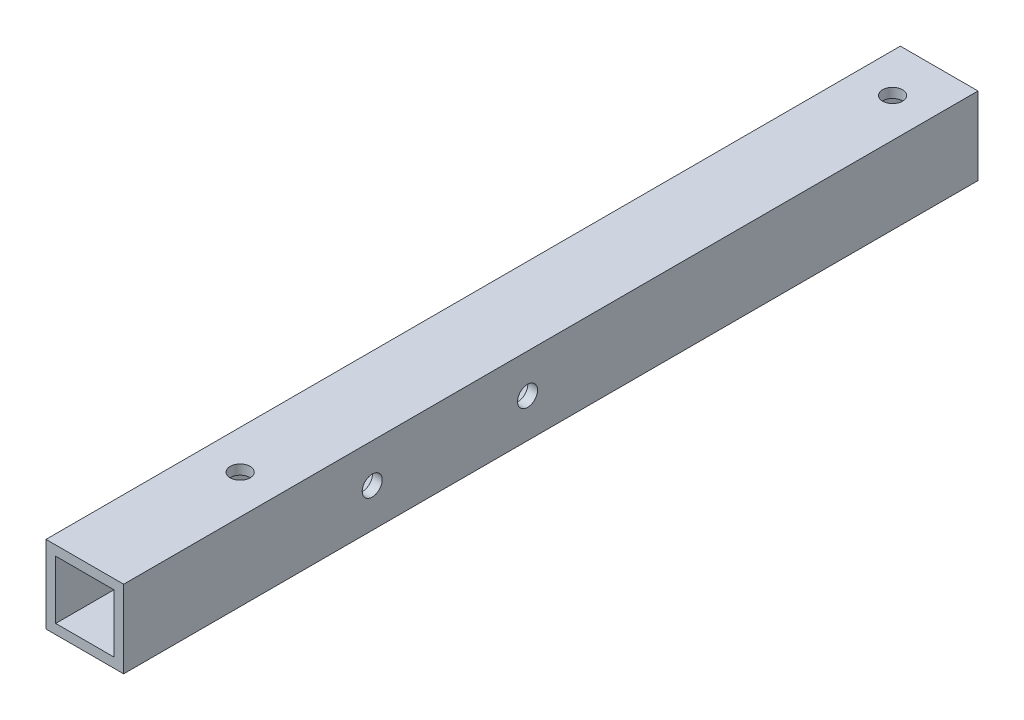
ISO-10303-21;
HEADER;
FILE_DESCRIPTION(('STEP AP214'),'2;1');
FILE_NAME('part.step','',(''),(''),'','','');
FILE_SCHEMA(('AUTOMOTIVE_DESIGN { 1 0 10303 214 1 1 1 1 }'));
ENDSEC;
DATA;
#1=APPLICATION_CONTEXT('core data for automotive mechanical design processes');
#2=APPLICATION_PROTOCOL_DEFINITION('international standard','automotive_design',2000,#1);
#3=PRODUCT_CONTEXT('',#1,'mechanical');
#4=PRODUCT('Part','Part','',(#3));
#5=PRODUCT_RELATED_PRODUCT_CATEGORY('part','',(#4));
#6=PRODUCT_DEFINITION_FORMATION('','',#4);
#7=PRODUCT_DEFINITION_CONTEXT('part definition',#1,'design');
#8=PRODUCT_DEFINITION('design','',#6,#7);
#9=PRODUCT_DEFINITION_SHAPE('','',#8);
#10=(LENGTH_UNIT() NAMED_UNIT(*) SI_UNIT(.MILLI.,.METRE.));
#11=(NAMED_UNIT(*) PLANE_ANGLE_UNIT() SI_UNIT($,.RADIAN.));
#12=(NAMED_UNIT(*) SI_UNIT($,.STERADIAN.) SOLID_ANGLE_UNIT());
#13=UNCERTAINTY_MEASURE_WITH_UNIT(LENGTH_MEASURE(1.E-05),#10,'distance_accuracy_value','');
#14=(GEOMETRIC_REPRESENTATION_CONTEXT(3) GLOBAL_UNCERTAINTY_ASSIGNED_CONTEXT((#13)) GLOBAL_UNIT_ASSIGNED_CONTEXT((#10,
#11,#12)) REPRESENTATION_CONTEXT('',''));
#15=CARTESIAN_POINT('',(0.,0.,0.));
#16=DIRECTION('',(0.,0.,1.));
#17=DIRECTION('',(1.,0.,0.));
#18=AXIS2_PLACEMENT_3D('',#15,#16,#17);
#19=CARTESIAN_POINT('',(0.,0.,279.4));
#20=DIRECTION('',(0.,0.,-1.));
#21=DIRECTION('',(-1.,0.,0.));
#22=AXIS2_PLACEMENT_3D('',#19,#20,#21);
#23=PLANE('',#22);
#24=DIRECTION('',(-1.,0.,0.));
#25=VECTOR('',#24,1.);
#26=CARTESIAN_POINT('',(12.7000000000001,-12.7,279.4));
#27=LINE('',#26,#25);
#28=CARTESIAN_POINT('',(12.7000000000001,-12.7,279.4));
#29=VERTEX_POINT('',#28);
#30=CARTESIAN_POINT('',(-12.6999999999999,-12.7,279.4));
#31=VERTEX_POINT('',#30);
#32=EDGE_CURVE('E141',#29,#31,#27,.T.);
#33=ORIENTED_EDGE('',*,*,#32,.F.);
#34=DIRECTION('',(0.,1.,0.));
#35=VECTOR('',#34,1.);
#36=CARTESIAN_POINT('',(12.7000000000001,-12.7,279.4));
#37=LINE('',#36,#35);
#38=CARTESIAN_POINT('',(12.7000000000001,12.7,279.4));
#39=VERTEX_POINT('',#38);
#40=EDGE_CURVE('E150',#29,#39,#37,.T.);
#41=ORIENTED_EDGE('',*,*,#40,.T.);
#42=DIRECTION('',(-1.,0.,0.));
#43=VECTOR('',#42,1.);
#44=CARTESIAN_POINT('',(12.7000000000001,12.7,279.4));
#45=LINE('',#44,#43);
#46=CARTESIAN_POINT('',(-12.6999999999999,12.7,279.4));
#47=VERTEX_POINT('',#46);
#48=EDGE_CURVE('E148',#39,#47,#45,.T.);
#49=ORIENTED_EDGE('',*,*,#48,.T.);
#50=DIRECTION('',(0.,1.,0.));
#51=VECTOR('',#50,1.);
#52=CARTESIAN_POINT('',(-12.6999999999999,-12.7,279.4));
#53=LINE('',#52,#51);
#54=EDGE_CURVE('E144',#31,#47,#53,.T.);
#55=ORIENTED_EDGE('',*,*,#54,.F.);
#56=EDGE_LOOP('',(#33,#41,#49,#55));
#57=FACE_BOUND('',#56,.T.);
#58=DIRECTION('',(0.,1.,0.));
#59=VECTOR('',#58,1.);
#60=CARTESIAN_POINT('',(9.52500000000005,-9.52499999999999,279.4));
#61=LINE('',#60,#59);
#62=CARTESIAN_POINT('',(9.52500000000005,-9.52499999999999,279.4));
#63=VERTEX_POINT('',#62);
#64=CARTESIAN_POINT('',(9.52500000000005,9.52499999999999,279.4));
#65=VERTEX_POINT('',#64);
#66=EDGE_CURVE('E103',#63,#65,#61,.T.);
#67=ORIENTED_EDGE('',*,*,#66,.F.);
#68=DIRECTION('',(1.,0.,0.));
#69=VECTOR('',#68,1.);
#70=CARTESIAN_POINT('',(-9.52500000000006,-9.52499999999999,279.4));
#71=LINE('',#70,#69);
#72=CARTESIAN_POINT('',(-9.52500000000006,-9.52499999999999,279.4));
#73=VERTEX_POINT('',#72);
#74=EDGE_CURVE('E125',#73,#63,#71,.T.);
#75=ORIENTED_EDGE('',*,*,#74,.F.);
#76=DIRECTION('',(0.,-1.,0.));
#77=VECTOR('',#76,1.);
#78=CARTESIAN_POINT('',(-9.52500000000006,-9.52499999999999,279.4));
#79=LINE('',#78,#77);
#80=CARTESIAN_POINT('',(-9.52500000000006,9.52499999999999,279.4));
#81=VERTEX_POINT('',#80);
#82=EDGE_CURVE('E123',#81,#73,#79,.T.);
#83=ORIENTED_EDGE('',*,*,#82,.F.);
#84=DIRECTION('',(-1.,0.,0.));
#85=VECTOR('',#84,1.);
#86=CARTESIAN_POINT('',(-9.52500000000006,9.52499999999999,279.4));
#87=LINE('',#86,#85);
#88=EDGE_CURVE('E111',#65,#81,#87,.T.);
#89=ORIENTED_EDGE('',*,*,#88,.F.);
#90=EDGE_LOOP('',(#67,#75,#83,#89));
#91=FACE_BOUND('',#90,.T.);
#92=ADVANCED_FACE('F37',(#57,#91),#23,.F.);
#93=CARTESIAN_POINT('',(0.,0.,0.));
#94=DIRECTION('',(0.,0.,-1.));
#95=DIRECTION('',(-1.,0.,0.));
#96=AXIS2_PLACEMENT_3D('',#93,#94,#95);
#97=PLANE('',#96);
#98=DIRECTION('',(-1.,0.,0.));
#99=VECTOR('',#98,1.);
#100=CARTESIAN_POINT('',(12.7000000000001,-12.7,0.));
#101=LINE('',#100,#99);
#102=CARTESIAN_POINT('',(12.7000000000001,-12.7,0.));
#103=VERTEX_POINT('',#102);
#104=CARTESIAN_POINT('',(-12.6999999999999,-12.7,0.));
#105=VERTEX_POINT('',#104);
#106=EDGE_CURVE('E119',#103,#105,#101,.T.);
#107=ORIENTED_EDGE('',*,*,#106,.T.);
#108=DIRECTION('',(0.,1.,0.));
#109=VECTOR('',#108,1.);
#110=CARTESIAN_POINT('',(-12.6999999999999,-12.7,0.));
#111=LINE('',#110,#109);
#112=CARTESIAN_POINT('',(-12.6999999999999,12.7,0.));
#113=VERTEX_POINT('',#112);
#114=EDGE_CURVE('E155',#105,#113,#111,.T.);
#115=ORIENTED_EDGE('',*,*,#114,.T.);
#116=DIRECTION('',(-1.,0.,0.));
#117=VECTOR('',#116,1.);
#118=CARTESIAN_POINT('',(12.7000000000001,12.7,0.));
#119=LINE('',#118,#117);
#120=CARTESIAN_POINT('',(12.7000000000001,12.7,0.));
#121=VERTEX_POINT('',#120);
#122=EDGE_CURVE('E158',#121,#113,#119,.T.);
#123=ORIENTED_EDGE('',*,*,#122,.F.);
#124=DIRECTION('',(0.,1.,0.));
#125=VECTOR('',#124,1.);
#126=CARTESIAN_POINT('',(12.7000000000001,-12.7,0.));
#127=LINE('',#126,#125);
#128=EDGE_CURVE('E145',#103,#121,#127,.T.);
#129=ORIENTED_EDGE('',*,*,#128,.F.);
#130=EDGE_LOOP('',(#107,#115,#123,#129));
#131=FACE_BOUND('',#130,.T.);
#132=DIRECTION('',(1.,0.,0.));
#133=VECTOR('',#132,1.);
#134=CARTESIAN_POINT('',(-9.52500000000006,-9.52499999999999,0.));
#135=LINE('',#134,#133);
#136=CARTESIAN_POINT('',(-9.52500000000006,-9.52499999999999,0.));
#137=VERTEX_POINT('',#136);
#138=CARTESIAN_POINT('',(9.52500000000005,-9.52499999999999,0.));
#139=VERTEX_POINT('',#138);
#140=EDGE_CURVE('E112',#137,#139,#135,.T.);
#141=ORIENTED_EDGE('',*,*,#140,.T.);
#142=DIRECTION('',(0.,1.,0.));
#143=VECTOR('',#142,1.);
#144=CARTESIAN_POINT('',(9.52500000000005,-9.52499999999999,0.));
#145=LINE('',#144,#143);
#146=CARTESIAN_POINT('',(9.52500000000005,9.52499999999999,0.));
#147=VERTEX_POINT('',#146);
#148=EDGE_CURVE('E62',#139,#147,#145,.T.);
#149=ORIENTED_EDGE('',*,*,#148,.T.);
#150=DIRECTION('',(-1.,0.,0.));
#151=VECTOR('',#150,1.);
#152=CARTESIAN_POINT('',(-9.52500000000006,9.52499999999999,0.));
#153=LINE('',#152,#151);
#154=CARTESIAN_POINT('',(-9.52500000000006,9.52499999999999,0.));
#155=VERTEX_POINT('',#154);
#156=EDGE_CURVE('E118',#147,#155,#153,.T.);
#157=ORIENTED_EDGE('',*,*,#156,.T.);
#158=DIRECTION('',(0.,-1.,0.));
#159=VECTOR('',#158,1.);
#160=CARTESIAN_POINT('',(-9.52500000000006,-9.52499999999999,0.));
#161=LINE('',#160,#159);
#162=EDGE_CURVE('E133',#155,#137,#161,.T.);
#163=ORIENTED_EDGE('',*,*,#162,.T.);
#164=EDGE_LOOP('',(#141,#149,#157,#163));
#165=FACE_BOUND('',#164,.T.);
#166=ADVANCED_FACE('F235',(#131,#165),#97,.T.);
#167=CARTESIAN_POINT('',(12.7000000000001,-12.7,279.4));
#168=DIRECTION('',(0.,-1.,0.));
#169=DIRECTION('',(0.,0.,-1.));
#170=AXIS2_PLACEMENT_3D('',#167,#168,#169);
#171=PLANE('',#170);
#172=CARTESIAN_POINT('',(0.,-12.7,228.6));
#173=DIRECTION('',(0.,1.,0.));
#174=DIRECTION('',(0.,0.,1.));
#175=AXIS2_PLACEMENT_3D('',#172,#173,#174);
#176=CIRCLE('',#175,3.2639);
#177=CARTESIAN_POINT('',(0.,-12.7,231.8639));
#178=VERTEX_POINT('',#177);
#179=EDGE_CURVE('E174',#178,#178,#176,.T.);
#180=ORIENTED_EDGE('',*,*,#179,.T.);
#181=EDGE_LOOP('',(#180));
#182=FACE_BOUND('',#181,.T.);
#183=CARTESIAN_POINT('',(0.,-12.7,15.24));
#184=DIRECTION('',(0.,1.,0.));
#185=DIRECTION('',(0.,0.,1.));
#186=AXIS2_PLACEMENT_3D('',#183,#184,#185);
#187=CIRCLE('',#186,3.2639);
#188=CARTESIAN_POINT('',(0.,-12.7,18.5039));
#189=VERTEX_POINT('',#188);
#190=EDGE_CURVE('E170',#189,#189,#187,.T.);
#191=ORIENTED_EDGE('',*,*,#190,.T.);
#192=EDGE_LOOP('',(#191));
#193=FACE_BOUND('',#192,.T.);
#194=ORIENTED_EDGE('',*,*,#106,.F.);
#195=DIRECTION('',(0.,0.,-1.));
#196=VECTOR('',#195,1.);
#197=CARTESIAN_POINT('',(12.7000000000001,-12.7,279.4));
#198=LINE('',#197,#196);
#199=EDGE_CURVE('E11',#29,#103,#198,.T.);
#200=ORIENTED_EDGE('',*,*,#199,.F.);
#201=ORIENTED_EDGE('',*,*,#32,.T.);
#202=DIRECTION('',(0.,0.,-1.));
#203=VECTOR('',#202,1.);
#204=CARTESIAN_POINT('',(-12.6999999999999,-12.7,279.4));
#205=LINE('',#204,#203);
#206=EDGE_CURVE('E152',#31,#105,#205,.T.);
#207=ORIENTED_EDGE('',*,*,#206,.T.);
#208=EDGE_LOOP('',(#194,#200,#201,#207));
#209=FACE_BOUND('',#208,.T.);
#210=ADVANCED_FACE('F39',(#182,#193,#209),#171,.T.);
#211=CARTESIAN_POINT('',(12.7000000000001,-12.7,279.4));
#212=DIRECTION('',(-1.,0.,0.));
#213=DIRECTION('',(0.,0.,1.));
#214=AXIS2_PLACEMENT_3D('',#211,#212,#213);
#215=PLANE('',#214);
#216=CARTESIAN_POINT('',(12.7000000000001,0.,198.12));
#217=DIRECTION('',(-1.,0.,0.));
#218=DIRECTION('',(0.,0.,1.));
#219=AXIS2_PLACEMENT_3D('',#216,#217,#218);
#220=CIRCLE('',#219,3.26389999999998);
#221=CARTESIAN_POINT('',(12.7000000000001,0.,201.3839));
#222=VERTEX_POINT('',#221);
#223=EDGE_CURVE('E178',#222,#222,#220,.T.);
#224=ORIENTED_EDGE('',*,*,#223,.T.);
#225=EDGE_LOOP('',(#224));
#226=FACE_BOUND('',#225,.T.);
#227=CARTESIAN_POINT('',(12.7000000000001,0.,147.32));
#228=DIRECTION('',(-1.,0.,0.));
#229=DIRECTION('',(0.,0.,1.));
#230=AXIS2_PLACEMENT_3D('',#227,#228,#229);
#231=CIRCLE('',#230,3.26389999999998);
#232=CARTESIAN_POINT('',(12.7000000000001,0.,150.5839));
#233=VERTEX_POINT('',#232);
#234=EDGE_CURVE('E189',#233,#233,#231,.T.);
#235=ORIENTED_EDGE('',*,*,#234,.T.);
#236=EDGE_LOOP('',(#235));
#237=FACE_BOUND('',#236,.T.);
#238=ORIENTED_EDGE('',*,*,#128,.T.);
#239=DIRECTION('',(0.,0.,-1.));
#240=VECTOR('',#239,1.);
#241=CARTESIAN_POINT('',(12.7000000000001,12.7,279.4));
#242=LINE('',#241,#240);
#243=EDGE_CURVE('E46',#39,#121,#242,.T.);
#244=ORIENTED_EDGE('',*,*,#243,.F.);
#245=ORIENTED_EDGE('',*,*,#40,.F.);
#246=ORIENTED_EDGE('',*,*,#199,.T.);
#247=EDGE_LOOP('',(#238,#244,#245,#246));
#248=FACE_BOUND('',#247,.T.);
#249=ADVANCED_FACE('F245',(#226,#237,#248),#215,.F.);
#250=CARTESIAN_POINT('',(12.7000000000001,12.7,279.4));
#251=DIRECTION('',(0.,-1.,0.));
#252=DIRECTION('',(0.,0.,-1.));
#253=AXIS2_PLACEMENT_3D('',#250,#251,#252);
#254=PLANE('',#253);
#255=CARTESIAN_POINT('',(0.,12.7,228.6));
#256=DIRECTION('',(0.,1.,0.));
#257=DIRECTION('',(0.,0.,1.));
#258=AXIS2_PLACEMENT_3D('',#255,#256,#257);
#259=CIRCLE('',#258,3.2639);
#260=CARTESIAN_POINT('',(0.,12.7,231.8639));
#261=VERTEX_POINT('',#260);
#262=EDGE_CURVE('E200',#261,#261,#259,.T.);
#263=ORIENTED_EDGE('',*,*,#262,.F.);
#264=EDGE_LOOP('',(#263));
#265=FACE_BOUND('',#264,.T.);
#266=CARTESIAN_POINT('',(0.,12.7,15.24));
#267=DIRECTION('',(0.,1.,0.));
#268=DIRECTION('',(0.,0.,1.));
#269=AXIS2_PLACEMENT_3D('',#266,#267,#268);
#270=CIRCLE('',#269,3.2639);
#271=CARTESIAN_POINT('',(0.,12.7,18.5039));
#272=VERTEX_POINT('',#271);
#273=EDGE_CURVE('E207',#272,#272,#270,.T.);
#274=ORIENTED_EDGE('',*,*,#273,.F.);
#275=EDGE_LOOP('',(#274));
#276=FACE_BOUND('',#275,.T.);
#277=ORIENTED_EDGE('',*,*,#122,.T.);
#278=DIRECTION('',(0.,0.,-1.));
#279=VECTOR('',#278,1.);
#280=CARTESIAN_POINT('',(-12.6999999999999,12.7,279.4));
#281=LINE('',#280,#279);
#282=EDGE_CURVE('E164',#47,#113,#281,.T.);
#283=ORIENTED_EDGE('',*,*,#282,.F.);
#284=ORIENTED_EDGE('',*,*,#48,.F.);
#285=ORIENTED_EDGE('',*,*,#243,.T.);
#286=EDGE_LOOP('',(#277,#283,#284,#285));
#287=FACE_BOUND('',#286,.T.);
#288=ADVANCED_FACE('F248',(#265,#276,#287),#254,.F.);
#289=CARTESIAN_POINT('',(-12.6999999999999,-12.7,279.4));
#290=DIRECTION('',(-1.,0.,0.));
#291=DIRECTION('',(0.,0.,1.));
#292=AXIS2_PLACEMENT_3D('',#289,#290,#291);
#293=PLANE('',#292);
#294=CARTESIAN_POINT('',(-12.6999999999999,0.,198.12));
#295=DIRECTION('',(-1.,0.,0.));
#296=DIRECTION('',(0.,0.,1.));
#297=AXIS2_PLACEMENT_3D('',#294,#295,#296);
#298=CIRCLE('',#297,3.26389999999998);
#299=CARTESIAN_POINT('',(-12.6999999999999,0.,201.3839));
#300=VERTEX_POINT('',#299);
#301=EDGE_CURVE('E184',#300,#300,#298,.T.);
#302=ORIENTED_EDGE('',*,*,#301,.F.);
#303=EDGE_LOOP('',(#302));
#304=FACE_BOUND('',#303,.T.);
#305=CARTESIAN_POINT('',(-12.6999999999999,0.,147.32));
#306=DIRECTION('',(-1.,0.,0.));
#307=DIRECTION('',(0.,0.,1.));
#308=AXIS2_PLACEMENT_3D('',#305,#306,#307);
#309=CIRCLE('',#308,3.26389999999998);
#310=CARTESIAN_POINT('',(-12.6999999999999,0.,150.5839));
#311=VERTEX_POINT('',#310);
#312=EDGE_CURVE('E194',#311,#311,#309,.T.);
#313=ORIENTED_EDGE('',*,*,#312,.F.);
#314=EDGE_LOOP('',(#313));
#315=FACE_BOUND('',#314,.T.);
#316=ORIENTED_EDGE('',*,*,#114,.F.);
#317=ORIENTED_EDGE('',*,*,#206,.F.);
#318=ORIENTED_EDGE('',*,*,#54,.T.);
#319=ORIENTED_EDGE('',*,*,#282,.T.);
#320=EDGE_LOOP('',(#316,#317,#318,#319));
#321=FACE_BOUND('',#320,.T.);
#322=ADVANCED_FACE('F230',(#304,#315,#321),#293,.T.);
#323=CARTESIAN_POINT('',(9.52500000000005,-9.52499999999999,279.4));
#324=DIRECTION('',(-1.,0.,0.));
#325=DIRECTION('',(0.,0.,1.));
#326=AXIS2_PLACEMENT_3D('',#323,#324,#325);
#327=PLANE('',#326);
#328=CARTESIAN_POINT('',(9.52500000000005,0.,198.12));
#329=DIRECTION('',(-1.,0.,0.));
#330=DIRECTION('',(0.,0.,1.));
#331=AXIS2_PLACEMENT_3D('',#328,#329,#330);
#332=CIRCLE('',#331,3.26389999999998);
#333=CARTESIAN_POINT('',(9.52500000000005,0.,201.3839));
#334=VERTEX_POINT('',#333);
#335=EDGE_CURVE('E197',#334,#334,#332,.T.);
#336=ORIENTED_EDGE('',*,*,#335,.F.);
#337=EDGE_LOOP('',(#336));
#338=FACE_BOUND('',#337,.T.);
#339=CARTESIAN_POINT('',(9.52500000000005,0.,147.32));
#340=DIRECTION('',(-1.,0.,0.));
#341=DIRECTION('',(0.,0.,1.));
#342=AXIS2_PLACEMENT_3D('',#339,#340,#341);
#343=CIRCLE('',#342,3.26389999999998);
#344=CARTESIAN_POINT('',(9.52500000000005,0.,150.5839));
#345=VERTEX_POINT('',#344);
#346=EDGE_CURVE('E177',#345,#345,#343,.T.);
#347=ORIENTED_EDGE('',*,*,#346,.F.);
#348=EDGE_LOOP('',(#347));
#349=FACE_BOUND('',#348,.T.);
#350=ORIENTED_EDGE('',*,*,#148,.F.);
#351=DIRECTION('',(0.,0.,-1.));
#352=VECTOR('',#351,1.);
#353=CARTESIAN_POINT('',(9.52500000000005,-9.52499999999999,279.4));
#354=LINE('',#353,#352);
#355=EDGE_CURVE('E107',#63,#139,#354,.T.);
#356=ORIENTED_EDGE('',*,*,#355,.F.);
#357=ORIENTED_EDGE('',*,*,#66,.T.);
#358=DIRECTION('',(0.,0.,-1.));
#359=VECTOR('',#358,1.);
#360=CARTESIAN_POINT('',(9.52500000000005,9.52499999999999,279.4));
#361=LINE('',#360,#359);
#362=EDGE_CURVE('E106',#65,#147,#361,.T.);
#363=ORIENTED_EDGE('',*,*,#362,.T.);
#364=EDGE_LOOP('',(#350,#356,#357,#363));
#365=FACE_BOUND('',#364,.T.);
#366=ADVANCED_FACE('F105',(#338,#349,#365),#327,.T.);
#367=CARTESIAN_POINT('',(-9.52500000000006,9.52499999999999,279.4));
#368=DIRECTION('',(0.,-1.,0.));
#369=DIRECTION('',(0.,0.,-1.));
#370=AXIS2_PLACEMENT_3D('',#367,#368,#369);
#371=PLANE('',#370);
#372=CARTESIAN_POINT('',(0.,9.52499999999999,228.6));
#373=DIRECTION('',(0.,-1.,0.));
#374=DIRECTION('',(0.,0.,-1.));
#375=AXIS2_PLACEMENT_3D('',#372,#373,#374);
#376=CIRCLE('',#375,3.2639);
#377=CARTESIAN_POINT('',(0.,9.52499999999999,225.3361));
#378=VERTEX_POINT('',#377);
#379=EDGE_CURVE('E173',#378,#378,#376,.T.);
#380=ORIENTED_EDGE('',*,*,#379,.F.);
#381=EDGE_LOOP('',(#380));
#382=FACE_BOUND('',#381,.T.);
#383=CARTESIAN_POINT('',(0.,9.52499999999999,15.24));
#384=DIRECTION('',(0.,-1.,0.));
#385=DIRECTION('',(0.,0.,-1.));
#386=AXIS2_PLACEMENT_3D('',#383,#384,#385);
#387=CIRCLE('',#386,3.2639);
#388=CARTESIAN_POINT('',(0.,9.52499999999999,11.9761));
#389=VERTEX_POINT('',#388);
#390=EDGE_CURVE('E131',#389,#389,#387,.T.);
#391=ORIENTED_EDGE('',*,*,#390,.F.);
#392=EDGE_LOOP('',(#391));
#393=FACE_BOUND('',#392,.T.);
#394=ORIENTED_EDGE('',*,*,#156,.F.);
#395=ORIENTED_EDGE('',*,*,#362,.F.);
#396=ORIENTED_EDGE('',*,*,#88,.T.);
#397=DIRECTION('',(0.,0.,-1.));
#398=VECTOR('',#397,1.);
#399=CARTESIAN_POINT('',(-9.52500000000006,9.52499999999999,279.4));
#400=LINE('',#399,#398);
#401=EDGE_CURVE('E120',#81,#155,#400,.T.);
#402=ORIENTED_EDGE('',*,*,#401,.T.);
#403=EDGE_LOOP('',(#394,#395,#396,#402));
#404=FACE_BOUND('',#403,.T.);
#405=ADVANCED_FACE('F115',(#382,#393,#404),#371,.T.);
#406=CARTESIAN_POINT('',(-9.52500000000006,-9.52499999999999,279.4));
#407=DIRECTION('',(1.,0.,0.));
#408=DIRECTION('',(0.,0.,-1.));
#409=AXIS2_PLACEMENT_3D('',#406,#407,#408);
#410=PLANE('',#409);
#411=CARTESIAN_POINT('',(-9.52500000000006,0.,198.12));
#412=DIRECTION('',(1.,0.,0.));
#413=DIRECTION('',(0.,0.,-1.));
#414=AXIS2_PLACEMENT_3D('',#411,#412,#413);
#415=CIRCLE('',#414,3.26389999999998);
#416=CARTESIAN_POINT('',(-9.52500000000006,0.,194.8561));
#417=VERTEX_POINT('',#416);
#418=EDGE_CURVE('E41',#417,#417,#415,.T.);
#419=ORIENTED_EDGE('',*,*,#418,.F.);
#420=EDGE_LOOP('',(#419));
#421=FACE_BOUND('',#420,.T.);
#422=CARTESIAN_POINT('',(-9.52500000000006,0.,147.32));
#423=DIRECTION('',(1.,0.,0.));
#424=DIRECTION('',(0.,0.,-1.));
#425=AXIS2_PLACEMENT_3D('',#422,#423,#424);
#426=CIRCLE('',#425,3.26389999999998);
#427=CARTESIAN_POINT('',(-9.52500000000006,0.,144.0561));
#428=VERTEX_POINT('',#427);
#429=EDGE_CURVE('E175',#428,#428,#426,.T.);
#430=ORIENTED_EDGE('',*,*,#429,.F.);
#431=EDGE_LOOP('',(#430));
#432=FACE_BOUND('',#431,.T.);
#433=ORIENTED_EDGE('',*,*,#162,.F.);
#434=ORIENTED_EDGE('',*,*,#401,.F.);
#435=ORIENTED_EDGE('',*,*,#82,.T.);
#436=DIRECTION('',(0.,0.,-1.));
#437=VECTOR('',#436,1.);
#438=CARTESIAN_POINT('',(-9.52500000000006,-9.52499999999999,279.4));
#439=LINE('',#438,#437);
#440=EDGE_CURVE('E54',#73,#137,#439,.T.);
#441=ORIENTED_EDGE('',*,*,#440,.T.);
#442=EDGE_LOOP('',(#433,#434,#435,#441));
#443=FACE_BOUND('',#442,.T.);
#444=ADVANCED_FACE('F218',(#421,#432,#443),#410,.T.);
#445=CARTESIAN_POINT('',(-9.52500000000006,-9.52499999999999,279.4));
#446=DIRECTION('',(0.,1.,0.));
#447=DIRECTION('',(0.,0.,1.));
#448=AXIS2_PLACEMENT_3D('',#445,#446,#447);
#449=PLANE('',#448);
#450=CARTESIAN_POINT('',(0.,-9.52499999999999,228.6));
#451=DIRECTION('',(0.,1.,0.));
#452=DIRECTION('',(0.,0.,1.));
#453=AXIS2_PLACEMENT_3D('',#450,#451,#452);
#454=CIRCLE('',#453,3.2639);
#455=CARTESIAN_POINT('',(0.,-9.52499999999999,231.8639));
#456=VERTEX_POINT('',#455);
#457=EDGE_CURVE('E171',#456,#456,#454,.T.);
#458=ORIENTED_EDGE('',*,*,#457,.F.);
#459=EDGE_LOOP('',(#458));
#460=FACE_BOUND('',#459,.T.);
#461=CARTESIAN_POINT('',(0.,-9.52499999999999,15.24));
#462=DIRECTION('',(0.,1.,0.));
#463=DIRECTION('',(0.,0.,1.));
#464=AXIS2_PLACEMENT_3D('',#461,#462,#463);
#465=CIRCLE('',#464,3.2639);
#466=CARTESIAN_POINT('',(0.,-9.52499999999999,18.5039));
#467=VERTEX_POINT('',#466);
#468=EDGE_CURVE('E167',#467,#467,#465,.T.);
#469=ORIENTED_EDGE('',*,*,#468,.F.);
#470=EDGE_LOOP('',(#469));
#471=FACE_BOUND('',#470,.T.);
#472=ORIENTED_EDGE('',*,*,#140,.F.);
#473=ORIENTED_EDGE('',*,*,#440,.F.);
#474=ORIENTED_EDGE('',*,*,#74,.T.);
#475=ORIENTED_EDGE('',*,*,#355,.T.);
#476=EDGE_LOOP('',(#472,#473,#474,#475));
#477=FACE_BOUND('',#476,.T.);
#478=ADVANCED_FACE('F226',(#460,#471,#477),#449,.T.);
#479=CARTESIAN_POINT('',(0.,-12.7,15.24));
#480=DIRECTION('',(0.,1.,0.));
#481=DIRECTION('',(0.,0.,1.));
#482=AXIS2_PLACEMENT_3D('',#479,#480,#481);
#483=CYLINDRICAL_SURFACE('',#482,3.2639);
#484=ORIENTED_EDGE('',*,*,#468,.T.);
#485=EDGE_LOOP('',(#484));
#486=FACE_BOUND('',#485,.T.);
#487=ORIENTED_EDGE('',*,*,#190,.F.);
#488=EDGE_LOOP('',(#487));
#489=FACE_BOUND('',#488,.T.);
#490=ADVANCED_FACE('F280',(#486,#489),#483,.F.);
#491=ORIENTED_EDGE('',*,*,#390,.T.);
#492=EDGE_LOOP('',(#491));
#493=FACE_BOUND('',#492,.T.);
#494=ORIENTED_EDGE('',*,*,#273,.T.);
#495=EDGE_LOOP('',(#494));
#496=FACE_BOUND('',#495,.T.);
#497=ADVANCED_FACE('F214',(#493,#496),#483,.F.);
#498=CARTESIAN_POINT('',(0.,-12.7,228.6));
#499=DIRECTION('',(0.,1.,0.));
#500=DIRECTION('',(0.,0.,1.));
#501=AXIS2_PLACEMENT_3D('',#498,#499,#500);
#502=CYLINDRICAL_SURFACE('',#501,3.2639);
#503=ORIENTED_EDGE('',*,*,#457,.T.);
#504=EDGE_LOOP('',(#503));
#505=FACE_BOUND('',#504,.T.);
#506=ORIENTED_EDGE('',*,*,#179,.F.);
#507=EDGE_LOOP('',(#506));
#508=FACE_BOUND('',#507,.T.);
#509=ADVANCED_FACE('F288',(#505,#508),#502,.F.);
#510=ORIENTED_EDGE('',*,*,#379,.T.);
#511=EDGE_LOOP('',(#510));
#512=FACE_BOUND('',#511,.T.);
#513=ORIENTED_EDGE('',*,*,#262,.T.);
#514=EDGE_LOOP('',(#513));
#515=FACE_BOUND('',#514,.T.);
#516=ADVANCED_FACE('F294',(#512,#515),#502,.F.);
#517=CARTESIAN_POINT('',(12.7000000000001,0.,147.32));
#518=DIRECTION('',(-1.,0.,0.));
#519=DIRECTION('',(0.,0.,1.));
#520=AXIS2_PLACEMENT_3D('',#517,#518,#519);
#521=CYLINDRICAL_SURFACE('',#520,3.26389999999998);
#522=ORIENTED_EDGE('',*,*,#429,.T.);
#523=EDGE_LOOP('',(#522));
#524=FACE_BOUND('',#523,.T.);
#525=ORIENTED_EDGE('',*,*,#312,.T.);
#526=EDGE_LOOP('',(#525));
#527=FACE_BOUND('',#526,.T.);
#528=ADVANCED_FACE('F296',(#524,#527),#521,.F.);
#529=CARTESIAN_POINT('',(12.7000000000001,0.,198.12));
#530=DIRECTION('',(-1.,0.,0.));
#531=DIRECTION('',(0.,0.,1.));
#532=AXIS2_PLACEMENT_3D('',#529,#530,#531);
#533=CYLINDRICAL_SURFACE('',#532,3.26389999999998);
#534=ORIENTED_EDGE('',*,*,#418,.T.);
#535=EDGE_LOOP('',(#534));
#536=FACE_BOUND('',#535,.T.);
#537=ORIENTED_EDGE('',*,*,#301,.T.);
#538=EDGE_LOOP('',(#537));
#539=FACE_BOUND('',#538,.T.);
#540=ADVANCED_FACE('F299',(#536,#539),#533,.F.);
#541=ORIENTED_EDGE('',*,*,#346,.T.);
#542=EDGE_LOOP('',(#541));
#543=FACE_BOUND('',#542,.T.);
#544=ORIENTED_EDGE('',*,*,#234,.F.);
#545=EDGE_LOOP('',(#544));
#546=FACE_BOUND('',#545,.T.);
#547=ADVANCED_FACE('F300',(#543,#546),#521,.F.);
#548=ORIENTED_EDGE('',*,*,#335,.T.);
#549=EDGE_LOOP('',(#548));
#550=FACE_BOUND('',#549,.T.);
#551=ORIENTED_EDGE('',*,*,#223,.F.);
#552=EDGE_LOOP('',(#551));
#553=FACE_BOUND('',#552,.T.);
#554=ADVANCED_FACE('F303',(#550,#553),#533,.F.);
#555=CLOSED_SHELL('',(#92,#166,#210,#249,#288,#322,#366,#405,#444,#478,#490,#497,#509,#516,#528,
#540,#547,#554));
#556=MANIFOLD_SOLID_BREP('B2',#555);
#557=ADVANCED_BREP_SHAPE_REPRESENTATION('',(#18,#556),#14);
#558=SHAPE_DEFINITION_REPRESENTATION(#9,#557);
ENDSEC;
END-ISO-10303-21;
